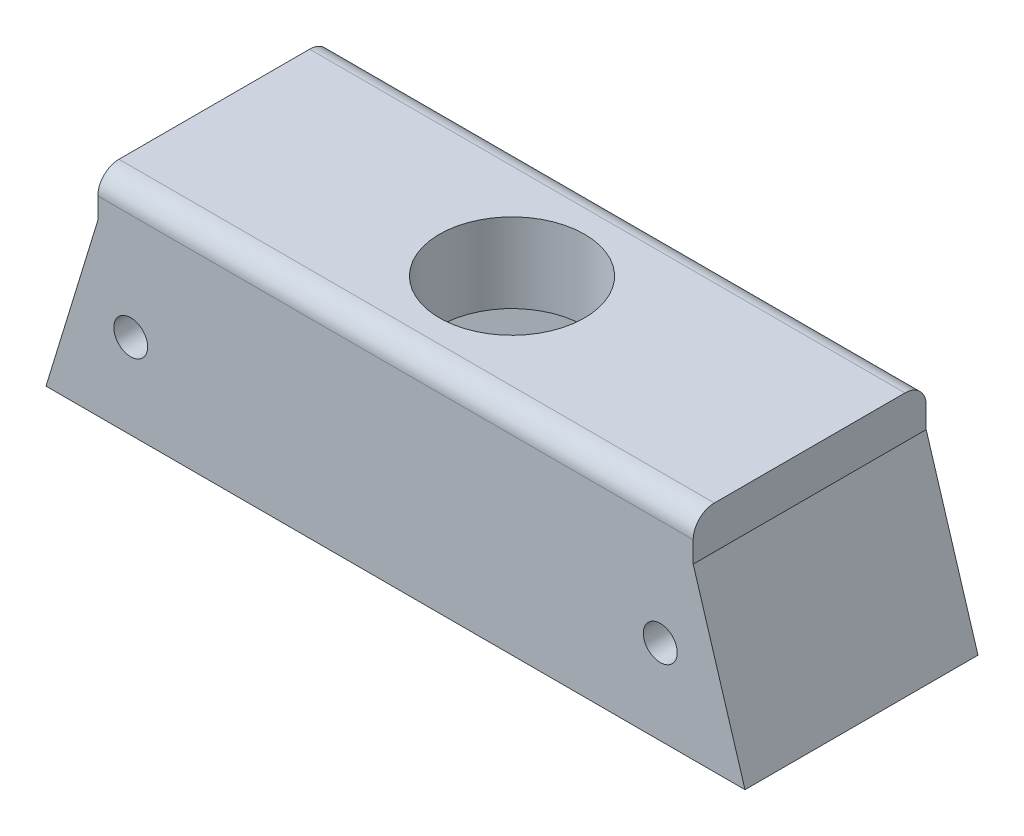
ISO-10303-21;
HEADER;
FILE_DESCRIPTION(('STEP AP214'),'2;1');
FILE_NAME('part.step','',(''),(''),'','','');
FILE_SCHEMA(('AUTOMOTIVE_DESIGN { 1 0 10303 214 1 1 1 1 }'));
ENDSEC;
DATA;
#1=APPLICATION_CONTEXT('core data for automotive mechanical design processes');
#2=APPLICATION_PROTOCOL_DEFINITION('international standard','automotive_design',2000,#1);
#3=PRODUCT_CONTEXT('',#1,'mechanical');
#4=PRODUCT('Part','Part','',(#3));
#5=PRODUCT_RELATED_PRODUCT_CATEGORY('part','',(#4));
#6=PRODUCT_DEFINITION_FORMATION('','',#4);
#7=PRODUCT_DEFINITION_CONTEXT('part definition',#1,'design');
#8=PRODUCT_DEFINITION('design','',#6,#7);
#9=PRODUCT_DEFINITION_SHAPE('','',#8);
#10=(LENGTH_UNIT() NAMED_UNIT(*) SI_UNIT(.MILLI.,.METRE.));
#11=(NAMED_UNIT(*) PLANE_ANGLE_UNIT() SI_UNIT($,.RADIAN.));
#12=(NAMED_UNIT(*) SI_UNIT($,.STERADIAN.) SOLID_ANGLE_UNIT());
#13=UNCERTAINTY_MEASURE_WITH_UNIT(LENGTH_MEASURE(1.E-05),#10,'distance_accuracy_value','');
#14=(GEOMETRIC_REPRESENTATION_CONTEXT(3) GLOBAL_UNCERTAINTY_ASSIGNED_CONTEXT((#13)) GLOBAL_UNIT_ASSIGNED_CONTEXT((#10,
#11,#12)) REPRESENTATION_CONTEXT('',''));
#15=CARTESIAN_POINT('',(0.,0.,0.));
#16=DIRECTION('',(0.,0.,1.));
#17=DIRECTION('',(1.,0.,0.));
#18=AXIS2_PLACEMENT_3D('',#15,#16,#17);
#19=CARTESIAN_POINT('',(0.,4.75,0.));
#20=DIRECTION('',(0.,-1.,0.));
#21=DIRECTION('',(1.,0.,0.));
#22=AXIS2_PLACEMENT_3D('',#19,#20,#21);
#23=PLANE('',#22);
#24=DIRECTION('',(-1.,0.,0.));
#25=VECTOR('',#24,1.);
#26=CARTESIAN_POINT('',(-11.,4.75,4.));
#27=LINE('',#26,#25);
#28=CARTESIAN_POINT('',(11.,4.75000000000001,4.));
#29=VERTEX_POINT('',#28);
#30=CARTESIAN_POINT('',(5.49173793336482,4.75000000000001,4.));
#31=VERTEX_POINT('',#30);
#32=EDGE_CURVE('E363',#29,#31,#27,.T.);
#33=ORIENTED_EDGE('',*,*,#32,.T.);
#34=CARTESIAN_POINT('',(0.,4.75,0.));
#35=DIRECTION('',(0.,-1.,0.));
#36=DIRECTION('',(1.,0.,0.));
#37=AXIS2_PLACEMENT_3D('',#34,#35,#36);
#38=CIRCLE('',#37,6.7940551608563);
#39=CARTESIAN_POINT('',(5.49173793336482,4.75000000000001,-4.));
#40=VERTEX_POINT('',#39);
#41=EDGE_CURVE('E258',#31,#40,#38,.F.);
#42=ORIENTED_EDGE('',*,*,#41,.T.);
#43=DIRECTION('',(1.,0.,0.));
#44=VECTOR('',#43,1.);
#45=CARTESIAN_POINT('',(-11.,4.75,-4.));
#46=LINE('',#45,#44);
#47=CARTESIAN_POINT('',(11.,4.75000000000001,-4.));
#48=VERTEX_POINT('',#47);
#49=EDGE_CURVE('E332',#40,#48,#46,.T.);
#50=ORIENTED_EDGE('',*,*,#49,.T.);
#51=DIRECTION('',(0.,0.,1.));
#52=VECTOR('',#51,1.);
#53=CARTESIAN_POINT('',(11.,4.75000000000001,4.));
#54=LINE('',#53,#52);
#55=EDGE_CURVE('E331',#48,#29,#54,.T.);
#56=ORIENTED_EDGE('',*,*,#55,.T.);
#57=EDGE_LOOP('',(#33,#42,#50,#56));
#58=FACE_BOUND('',#57,.T.);
#59=ADVANCED_FACE('F38',(#58),#23,.T.);
#60=CARTESIAN_POINT('',(0.,8.000012,0.));
#61=DIRECTION('',(0.,-1.,0.));
#62=DIRECTION('',(0.,0.,-1.));
#63=AXIS2_PLACEMENT_3D('',#60,#61,#62);
#64=CYLINDRICAL_SURFACE('',#63,3.425);
#65=CARTESIAN_POINT('',(0.,6.25,0.));
#66=DIRECTION('',(0.,-1.,0.));
#67=DIRECTION('',(0.,0.,-1.));
#68=AXIS2_PLACEMENT_3D('',#65,#66,#67);
#69=CIRCLE('',#68,3.425);
#70=CARTESIAN_POINT('',(0.,6.25,-3.425));
#71=VERTEX_POINT('',#70);
#72=EDGE_CURVE('E253',#71,#71,#69,.T.);
#73=CARTESIAN_POINT('',(0.,10.,0.));
#74=DIRECTION('',(0.,1.,0.));
#75=DIRECTION('',(0.,0.,1.));
#76=AXIS2_PLACEMENT_3D('',#73,#74,#75);
#77=CIRCLE('',#76,3.425);
#78=CARTESIAN_POINT('',(0.,10.,-3.425));
#79=VERTEX_POINT('',#78);
#80=EDGE_CURVE('E474',#79,#79,#77,.T.);
#81=CARTESIAN_POINT('',(0.,6.25,-3.425));
#82=CARTESIAN_POINT('',(0.,6.2890625,-3.425));
#83=CARTESIAN_POINT('',(0.,6.328125,-3.425));
#84=CARTESIAN_POINT('',(0.,6.40625,-3.425));
#85=CARTESIAN_POINT('',(0.,6.4453125,-3.425));
#86=CARTESIAN_POINT('',(0.,6.5234375,-3.425));
#87=CARTESIAN_POINT('',(0.,6.5625,-3.425));
#88=CARTESIAN_POINT('',(0.,6.640625,-3.425));
#89=CARTESIAN_POINT('',(0.,6.6796875,-3.425));
#90=CARTESIAN_POINT('',(0.,6.7578125,-3.425));
#91=CARTESIAN_POINT('',(0.,6.796875,-3.425));
#92=CARTESIAN_POINT('',(0.,6.875,-3.425));
#93=CARTESIAN_POINT('',(0.,6.9140625,-3.425));
#94=CARTESIAN_POINT('',(0.,6.9921875,-3.425));
#95=CARTESIAN_POINT('',(0.,7.03125,-3.425));
#96=CARTESIAN_POINT('',(0.,7.109375,-3.425));
#97=CARTESIAN_POINT('',(0.,7.1484375,-3.425));
#98=CARTESIAN_POINT('',(0.,7.2265625,-3.425));
#99=CARTESIAN_POINT('',(0.,7.265625,-3.425));
#100=CARTESIAN_POINT('',(0.,7.34375,-3.425));
#101=CARTESIAN_POINT('',(0.,7.3828125,-3.425));
#102=CARTESIAN_POINT('',(0.,7.4609375,-3.425));
#103=CARTESIAN_POINT('',(0.,7.5,-3.425));
#104=CARTESIAN_POINT('',(0.,7.578125,-3.425));
#105=CARTESIAN_POINT('',(0.,7.6171875,-3.425));
#106=CARTESIAN_POINT('',(0.,7.6953125,-3.425));
#107=CARTESIAN_POINT('',(0.,7.734375,-3.425));
#108=CARTESIAN_POINT('',(0.,7.8125,-3.425));
#109=CARTESIAN_POINT('',(0.,7.8515625,-3.425));
#110=CARTESIAN_POINT('',(0.,7.9296875,-3.425));
#111=CARTESIAN_POINT('',(0.,7.96875,-3.425));
#112=CARTESIAN_POINT('',(0.,8.046875,-3.425));
#113=CARTESIAN_POINT('',(0.,8.0859375,-3.425));
#114=CARTESIAN_POINT('',(0.,8.1640625,-3.425));
#115=CARTESIAN_POINT('',(0.,8.203125,-3.425));
#116=CARTESIAN_POINT('',(0.,8.28125,-3.425));
#117=CARTESIAN_POINT('',(0.,8.3203125,-3.425));
#118=CARTESIAN_POINT('',(0.,8.3984375,-3.425));
#119=CARTESIAN_POINT('',(0.,8.4375,-3.425));
#120=CARTESIAN_POINT('',(0.,8.515625,-3.425));
#121=CARTESIAN_POINT('',(0.,8.5546875,-3.425));
#122=CARTESIAN_POINT('',(0.,8.6328125,-3.425));
#123=CARTESIAN_POINT('',(0.,8.671875,-3.425));
#124=CARTESIAN_POINT('',(0.,8.75,-3.425));
#125=CARTESIAN_POINT('',(0.,8.7890625,-3.425));
#126=CARTESIAN_POINT('',(0.,8.8671875,-3.425));
#127=CARTESIAN_POINT('',(0.,8.90625,-3.425));
#128=CARTESIAN_POINT('',(0.,8.984375,-3.425));
#129=CARTESIAN_POINT('',(0.,9.0234375,-3.425));
#130=CARTESIAN_POINT('',(0.,9.1015625,-3.425));
#131=CARTESIAN_POINT('',(0.,9.140625,-3.425));
#132=CARTESIAN_POINT('',(0.,9.21875,-3.425));
#133=CARTESIAN_POINT('',(0.,9.2578125,-3.425));
#134=CARTESIAN_POINT('',(0.,9.3359375,-3.425));
#135=CARTESIAN_POINT('',(0.,9.375,-3.425));
#136=CARTESIAN_POINT('',(0.,9.453125,-3.425));
#137=CARTESIAN_POINT('',(0.,9.4921875,-3.425));
#138=CARTESIAN_POINT('',(0.,9.5703125,-3.425));
#139=CARTESIAN_POINT('',(0.,9.609375,-3.425));
#140=CARTESIAN_POINT('',(0.,9.6875,-3.425));
#141=CARTESIAN_POINT('',(0.,9.7265625,-3.425));
#142=CARTESIAN_POINT('',(0.,9.8046875,-3.425));
#143=CARTESIAN_POINT('',(0.,9.84375,-3.425));
#144=CARTESIAN_POINT('',(0.,9.921875,-3.425));
#145=CARTESIAN_POINT('',(0.,9.9609375,-3.425));
#146=CARTESIAN_POINT('',(0.,10.,-3.425));
#147=B_SPLINE_CURVE_WITH_KNOTS('',3,(#81,#82,#83,#84,#85,#86,#87,#88,#89,#90,#91,#92,#93,#94,
#95,#96,#97,#98,#99,#100,#101,#102,#103,#104,#105,#106,#107,#108,#109,#110,#111,#112,#113,#114,
#115,#116,#117,#118,#119,#120,#121,#122,#123,#124,#125,#126,#127,#128,#129,#130,#131,#132,#133,
#134,#135,#136,#137,#138,#139,#140,#141,#142,#143,#144,#145,#146),.UNSPECIFIED.,.F.,.F.,(4,2,2,
2,2,2,2,2,2,2,2,2,2,2,2,2,2,2,2,2,2,2,2,2,2,2,2,2,2,2,2,2,4),(0.,0.1171875,0.234375,0.3515625,
0.46875,0.585937500000001,0.703125000000001,0.820312500000001,0.9375,1.0546875,1.171875,
1.2890625,1.40625,1.5234375,1.640625,1.7578125,1.875,1.9921875,2.109375,2.2265625,2.34375,
2.4609375,2.578125,2.6953125,2.8125,2.9296875,3.046875,3.1640625,3.28125,3.3984375,3.515625,
3.6328125,3.75),.UNSPECIFIED.);
#148=EDGE_CURVE('BSEAM297',#71,#79,#147,.T.);
#149=ORIENTED_EDGE('',*,*,#72,.T.);
#150=ORIENTED_EDGE('',*,*,#80,.T.);
#151=ORIENTED_EDGE('',*,*,#148,.T.);
#152=ORIENTED_EDGE('',*,*,#148,.F.);
#153=EDGE_LOOP('',(#149,#151,#150,#152));
#154=FACE_BOUND('',#153,.T.);
#155=ADVANCED_FACE('F297',(#154),#64,.F.);
#156=CARTESIAN_POINT('',(14.2356732963533,2.50000000000001,-35.6039864469807));
#157=DIRECTION('',(0.,1.,0.));
#158=DIRECTION('',(-1.,0.,0.));
#159=AXIS2_PLACEMENT_3D('',#156,#157,#158);
#160=PLANE('',#159);
#161=DIRECTION('',(-1.,0.,0.));
#162=VECTOR('',#161,1.);
#163=CARTESIAN_POINT('',(14.2356732963533,2.50000000000001,-3.99999999999997));
#164=LINE('',#163,#162);
#165=CARTESIAN_POINT('',(-12.1230183869521,2.5,-3.99999999999997));
#166=VERTEX_POINT('',#165);
#167=CARTESIAN_POINT('',(-14.2356732963533,2.5,-3.99999999999997));
#168=VERTEX_POINT('',#167);
#169=EDGE_CURVE('E392',#166,#168,#164,.T.);
#170=ORIENTED_EDGE('',*,*,#169,.F.);
#171=DIRECTION('',(0.,0.,1.));
#172=VECTOR('',#171,1.);
#173=CARTESIAN_POINT('',(-12.1230183869521,2.5,-35.6039864469807));
#174=LINE('',#173,#172);
#175=CARTESIAN_POINT('',(-12.1230183869521,2.5,4.00000000000003));
#176=VERTEX_POINT('',#175);
#177=EDGE_CURVE('E340',#166,#176,#174,.T.);
#178=ORIENTED_EDGE('',*,*,#177,.T.);
#179=DIRECTION('',(-1.,0.,0.));
#180=VECTOR('',#179,1.);
#181=CARTESIAN_POINT('',(14.2356732963533,2.50000000000001,4.00000000000003));
#182=LINE('',#181,#180);
#183=CARTESIAN_POINT('',(-14.2356732963534,2.5,4.00000000000003));
#184=VERTEX_POINT('',#183);
#185=EDGE_CURVE('E376',#176,#184,#182,.T.);
#186=ORIENTED_EDGE('',*,*,#185,.T.);
#187=DIRECTION('',(0.,0.,1.));
#188=VECTOR('',#187,1.);
#189=CARTESIAN_POINT('',(-14.2356732963534,2.5,-35.6039864469807));
#190=LINE('',#189,#188);
#191=EDGE_CURVE('E389',#168,#184,#190,.T.);
#192=ORIENTED_EDGE('',*,*,#191,.F.);
#193=EDGE_LOOP('',(#170,#178,#186,#192));
#194=FACE_BOUND('',#193,.T.);
#195=ADVANCED_FACE('F304',(#194),#160,.F.);
#196=CARTESIAN_POINT('',(0.,8.,-5.49999999999997));
#197=DIRECTION('',(0.,0.,-1.));
#198=DIRECTION('',(-1.,0.,0.));
#199=AXIS2_PLACEMENT_3D('',#196,#197,#198);
#200=PLANE('',#199);
#201=DIRECTION('',(0.,-1.,0.));
#202=VECTOR('',#201,1.);
#203=CARTESIAN_POINT('',(-14.0541545483307,10.,-5.49999999999997));
#204=LINE('',#203,#202);
#205=CARTESIAN_POINT('',(-14.0541545483307,9.,-5.49999999999997));
#206=VERTEX_POINT('',#205);
#207=CARTESIAN_POINT('',(-14.0541545483307,8.,-5.49999999999997));
#208=VERTEX_POINT('',#207);
#209=EDGE_CURVE('E194',#206,#208,#204,.T.);
#210=ORIENTED_EDGE('',*,*,#209,.F.);
#211=DIRECTION('',(-1.,0.,0.));
#212=VECTOR('',#211,1.);
#213=CARTESIAN_POINT('',(0.,9.,-5.49999999999997));
#214=LINE('',#213,#212);
#215=CARTESIAN_POINT('',(14.0541545483307,9.,-5.49999999999997));
#216=VERTEX_POINT('',#215);
#217=EDGE_CURVE('E246',#206,#216,#214,.F.);
#218=ORIENTED_EDGE('',*,*,#217,.T.);
#219=DIRECTION('',(0.,-1.,0.));
#220=VECTOR('',#219,1.);
#221=CARTESIAN_POINT('',(14.0541545483307,10.,-5.49999999999997));
#222=LINE('',#221,#220);
#223=CARTESIAN_POINT('',(14.0541545483307,8.,-5.49999999999997));
#224=VERTEX_POINT('',#223);
#225=EDGE_CURVE('E467',#216,#224,#222,.T.);
#226=ORIENTED_EDGE('',*,*,#225,.T.);
#227=DIRECTION('',(0.292371704722737,-0.956304755963035,0.));
#228=VECTOR('',#227,1.);
#229=CARTESIAN_POINT('',(16.5,0.,-5.49999999999997));
#230=LINE('',#229,#228);
#231=CARTESIAN_POINT('',(16.5,0.,-5.49999999999997));
#232=VERTEX_POINT('',#231);
#233=EDGE_CURVE('E207',#224,#232,#230,.T.);
#234=ORIENTED_EDGE('',*,*,#233,.T.);
#235=DIRECTION('',(1.,0.,0.));
#236=VECTOR('',#235,1.);
#237=CARTESIAN_POINT('',(0.,0.,-5.49999999999997));
#238=LINE('',#237,#236);
#239=CARTESIAN_POINT('',(-16.5,0.,-5.49999999999997));
#240=VERTEX_POINT('',#239);
#241=EDGE_CURVE('E230',#240,#232,#238,.T.);
#242=ORIENTED_EDGE('',*,*,#241,.F.);
#243=DIRECTION('',(0.292371704722737,0.956304755963035,0.));
#244=VECTOR('',#243,1.);
#245=CARTESIAN_POINT('',(-16.5,0.,-5.49999999999997));
#246=LINE('',#245,#244);
#247=EDGE_CURVE('E198',#240,#208,#246,.T.);
#248=ORIENTED_EDGE('',*,*,#247,.T.);
#249=EDGE_LOOP('',(#210,#218,#226,#234,#242,#248));
#250=FACE_BOUND('',#249,.T.);
#251=CARTESIAN_POINT('',(-12.5,4.,-5.49999999999997));
#252=DIRECTION('',(0.,0.,1.));
#253=DIRECTION('',(1.,0.,0.));
#254=AXIS2_PLACEMENT_3D('',#251,#252,#253);
#255=CIRCLE('',#254,0.800000000000001);
#256=CARTESIAN_POINT('',(-11.7,4.,-5.49999999999997));
#257=VERTEX_POINT('',#256);
#258=EDGE_CURVE('E216',#257,#257,#255,.T.);
#259=ORIENTED_EDGE('',*,*,#258,.T.);
#260=EDGE_LOOP('',(#259));
#261=FACE_BOUND('',#260,.T.);
#262=CARTESIAN_POINT('',(12.5,4.,-5.49999999999997));
#263=DIRECTION('',(0.,0.,1.));
#264=DIRECTION('',(1.,0.,0.));
#265=AXIS2_PLACEMENT_3D('',#262,#263,#264);
#266=CIRCLE('',#265,0.800000000000001);
#267=CARTESIAN_POINT('',(13.3,4.,-5.49999999999997));
#268=VERTEX_POINT('',#267);
#269=EDGE_CURVE('E223',#268,#268,#266,.T.);
#270=ORIENTED_EDGE('',*,*,#269,.T.);
#271=EDGE_LOOP('',(#270));
#272=FACE_BOUND('',#271,.T.);
#273=ADVANCED_FACE('F435',(#250,#261,#272),#200,.T.);
#274=CARTESIAN_POINT('',(0.,8.,5.50000000000003));
#275=DIRECTION('',(0.,0.,-1.));
#276=DIRECTION('',(-1.,0.,0.));
#277=AXIS2_PLACEMENT_3D('',#274,#275,#276);
#278=PLANE('',#277);
#279=CARTESIAN_POINT('',(-12.5,4.,5.50000000000003));
#280=DIRECTION('',(0.,0.,1.));
#281=DIRECTION('',(1.,0.,0.));
#282=AXIS2_PLACEMENT_3D('',#279,#280,#281);
#283=CIRCLE('',#282,0.800000000000001);
#284=CARTESIAN_POINT('',(-11.7,4.,5.50000000000003));
#285=VERTEX_POINT('',#284);
#286=EDGE_CURVE('E220',#285,#285,#283,.T.);
#287=ORIENTED_EDGE('',*,*,#286,.F.);
#288=EDGE_LOOP('',(#287));
#289=FACE_BOUND('',#288,.T.);
#290=CARTESIAN_POINT('',(12.5,4.,5.50000000000003));
#291=DIRECTION('',(0.,0.,1.));
#292=DIRECTION('',(1.,0.,0.));
#293=AXIS2_PLACEMENT_3D('',#290,#291,#292);
#294=CIRCLE('',#293,0.800000000000001);
#295=CARTESIAN_POINT('',(13.3,4.,5.50000000000003));
#296=VERTEX_POINT('',#295);
#297=EDGE_CURVE('E197',#296,#296,#294,.T.);
#298=ORIENTED_EDGE('',*,*,#297,.F.);
#299=EDGE_LOOP('',(#298));
#300=FACE_BOUND('',#299,.T.);
#301=DIRECTION('',(0.,-1.,0.));
#302=VECTOR('',#301,1.);
#303=CARTESIAN_POINT('',(14.0541545483307,10.,5.50000000000003));
#304=LINE('',#303,#302);
#305=CARTESIAN_POINT('',(14.0541545483307,9.,5.50000000000003));
#306=VERTEX_POINT('',#305);
#307=CARTESIAN_POINT('',(14.0541545483307,8.,5.50000000000003));
#308=VERTEX_POINT('',#307);
#309=EDGE_CURVE('E187',#306,#308,#304,.T.);
#310=ORIENTED_EDGE('',*,*,#309,.F.);
#311=DIRECTION('',(1.,0.,0.));
#312=VECTOR('',#311,1.);
#313=CARTESIAN_POINT('',(-14.0541545483307,9.,5.50000000000003));
#314=LINE('',#313,#312);
#315=CARTESIAN_POINT('',(-14.0541545483307,9.,5.50000000000003));
#316=VERTEX_POINT('',#315);
#317=EDGE_CURVE('E183',#306,#316,#314,.F.);
#318=ORIENTED_EDGE('',*,*,#317,.T.);
#319=DIRECTION('',(0.,-1.,0.));
#320=VECTOR('',#319,1.);
#321=CARTESIAN_POINT('',(-14.0541545483307,10.,5.50000000000003));
#322=LINE('',#321,#320);
#323=CARTESIAN_POINT('',(-14.0541545483307,8.,5.50000000000003));
#324=VERTEX_POINT('',#323);
#325=EDGE_CURVE('E174',#316,#324,#322,.T.);
#326=ORIENTED_EDGE('',*,*,#325,.T.);
#327=DIRECTION('',(0.292371704722737,0.956304755963035,0.));
#328=VECTOR('',#327,1.);
#329=CARTESIAN_POINT('',(-16.5,0.,5.50000000000003));
#330=LINE('',#329,#328);
#331=CARTESIAN_POINT('',(-16.5,0.,5.50000000000003));
#332=VERTEX_POINT('',#331);
#333=EDGE_CURVE('E180',#332,#324,#330,.T.);
#334=ORIENTED_EDGE('',*,*,#333,.F.);
#335=DIRECTION('',(1.,0.,0.));
#336=VECTOR('',#335,1.);
#337=CARTESIAN_POINT('',(0.,0.,5.50000000000003));
#338=LINE('',#337,#336);
#339=CARTESIAN_POINT('',(16.5,0.,5.50000000000003));
#340=VERTEX_POINT('',#339);
#341=EDGE_CURVE('E234',#332,#340,#338,.T.);
#342=ORIENTED_EDGE('',*,*,#341,.T.);
#343=DIRECTION('',(0.292371704722737,-0.956304755963035,0.));
#344=VECTOR('',#343,1.);
#345=CARTESIAN_POINT('',(16.5,0.,5.50000000000003));
#346=LINE('',#345,#344);
#347=EDGE_CURVE('E213',#308,#340,#346,.T.);
#348=ORIENTED_EDGE('',*,*,#347,.F.);
#349=EDGE_LOOP('',(#310,#318,#326,#334,#342,#348));
#350=FACE_BOUND('',#349,.T.);
#351=ADVANCED_FACE('F177',(#289,#300,#350),#278,.F.);
#352=CARTESIAN_POINT('',(0.,0.,0.));
#353=DIRECTION('',(0.,1.,0.));
#354=DIRECTION('',(0.,0.,1.));
#355=AXIS2_PLACEMENT_3D('',#352,#353,#354);
#356=PLANE('',#355);
#357=DIRECTION('',(1.,0.,0.));
#358=VECTOR('',#357,1.);
#359=CARTESIAN_POINT('',(-15.,0.,4.00000000000003));
#360=LINE('',#359,#358);
#361=CARTESIAN_POINT('',(-15.,0.,4.00000000000003));
#362=VERTEX_POINT('',#361);
#363=CARTESIAN_POINT('',(15.,0.,4.00000000000003));
#364=VERTEX_POINT('',#363);
#365=EDGE_CURVE('E380',#362,#364,#360,.T.);
#366=ORIENTED_EDGE('',*,*,#365,.T.);
#367=DIRECTION('',(0.,0.,1.));
#368=VECTOR('',#367,1.);
#369=CARTESIAN_POINT('',(15.,0.,-35.6039864469807));
#370=LINE('',#369,#368);
#371=CARTESIAN_POINT('',(15.,0.,-3.99999999999997));
#372=VERTEX_POINT('',#371);
#373=EDGE_CURVE('E386',#372,#364,#370,.T.);
#374=ORIENTED_EDGE('',*,*,#373,.F.);
#375=DIRECTION('',(1.,0.,0.));
#376=VECTOR('',#375,1.);
#377=CARTESIAN_POINT('',(-15.,0.,-3.99999999999997));
#378=LINE('',#377,#376);
#379=CARTESIAN_POINT('',(-15.,0.,-3.99999999999997));
#380=VERTEX_POINT('',#379);
#381=EDGE_CURVE('E375',#380,#372,#378,.T.);
#382=ORIENTED_EDGE('',*,*,#381,.F.);
#383=DIRECTION('',(0.,0.,1.));
#384=VECTOR('',#383,1.);
#385=CARTESIAN_POINT('',(-15.,0.,-35.6039864469807));
#386=LINE('',#385,#384);
#387=EDGE_CURVE('E214',#380,#362,#386,.T.);
#388=ORIENTED_EDGE('',*,*,#387,.T.);
#389=EDGE_LOOP('',(#366,#374,#382,#388));
#390=FACE_BOUND('',#389,.T.);
#391=DIRECTION('',(0.,0.,1.));
#392=VECTOR('',#391,1.);
#393=CARTESIAN_POINT('',(16.5,0.,0.));
#394=LINE('',#393,#392);
#395=EDGE_CURVE('E219',#232,#340,#394,.T.);
#396=ORIENTED_EDGE('',*,*,#395,.T.);
#397=ORIENTED_EDGE('',*,*,#341,.F.);
#398=DIRECTION('',(0.,0.,1.));
#399=VECTOR('',#398,1.);
#400=CARTESIAN_POINT('',(-16.5,0.,0.));
#401=LINE('',#400,#399);
#402=EDGE_CURVE('E202',#240,#332,#401,.T.);
#403=ORIENTED_EDGE('',*,*,#402,.F.);
#404=ORIENTED_EDGE('',*,*,#241,.T.);
#405=EDGE_LOOP('',(#396,#397,#403,#404));
#406=FACE_BOUND('',#405,.T.);
#407=ADVANCED_FACE('F404',(#390,#406),#356,.F.);
#408=CARTESIAN_POINT('',(12.5,4.,-5.49999999999997));
#409=DIRECTION('',(0.,0.,1.));
#410=DIRECTION('',(1.,0.,0.));
#411=AXIS2_PLACEMENT_3D('',#408,#409,#410);
#412=CYLINDRICAL_SURFACE('',#411,0.800000000000001);
#413=ORIENTED_EDGE('',*,*,#269,.F.);
#414=EDGE_LOOP('',(#413));
#415=FACE_BOUND('',#414,.T.);
#416=ORIENTED_EDGE('',*,*,#297,.T.);
#417=EDGE_LOOP('',(#416));
#418=FACE_BOUND('',#417,.T.);
#419=ADVANCED_FACE('F484',(#415,#418),#412,.F.);
#420=CARTESIAN_POINT('',(-12.5,4.,-5.49999999999997));
#421=DIRECTION('',(0.,0.,1.));
#422=DIRECTION('',(1.,0.,0.));
#423=AXIS2_PLACEMENT_3D('',#420,#421,#422);
#424=CYLINDRICAL_SURFACE('',#423,0.800000000000001);
#425=ORIENTED_EDGE('',*,*,#258,.F.);
#426=EDGE_LOOP('',(#425));
#427=FACE_BOUND('',#426,.T.);
#428=ORIENTED_EDGE('',*,*,#286,.T.);
#429=EDGE_LOOP('',(#428));
#430=FACE_BOUND('',#429,.T.);
#431=ADVANCED_FACE('F488',(#427,#430),#424,.F.);
#432=CARTESIAN_POINT('',(16.5,0.,-5.49999999999997));
#433=DIRECTION('',(-0.956304755963036,-0.292371704722737,0.));
#434=DIRECTION('',(0.292371704722737,-0.956304755963035,0.));
#435=AXIS2_PLACEMENT_3D('',#432,#433,#434);
#436=PLANE('',#435);
#437=ORIENTED_EDGE('',*,*,#347,.T.);
#438=ORIENTED_EDGE('',*,*,#395,.F.);
#439=ORIENTED_EDGE('',*,*,#233,.F.);
#440=DIRECTION('',(0.,0.,1.));
#441=VECTOR('',#440,1.);
#442=CARTESIAN_POINT('',(14.0541545483307,8.,-5.49999999999997));
#443=LINE('',#442,#441);
#444=EDGE_CURVE('E203',#224,#308,#443,.T.);
#445=ORIENTED_EDGE('',*,*,#444,.T.);
#446=EDGE_LOOP('',(#437,#438,#439,#445));
#447=FACE_BOUND('',#446,.T.);
#448=ADVANCED_FACE('F481',(#447),#436,.F.);
#449=CARTESIAN_POINT('',(-16.5,0.,-5.49999999999997));
#450=DIRECTION('',(0.956304755963036,-0.292371704722737,0.));
#451=DIRECTION('',(0.292371704722737,0.956304755963035,0.));
#452=AXIS2_PLACEMENT_3D('',#449,#450,#451);
#453=PLANE('',#452);
#454=ORIENTED_EDGE('',*,*,#333,.T.);
#455=DIRECTION('',(0.,0.,1.));
#456=VECTOR('',#455,1.);
#457=CARTESIAN_POINT('',(-14.0541545483307,8.,-5.49999999999997));
#458=LINE('',#457,#456);
#459=EDGE_CURVE('E190',#208,#324,#458,.T.);
#460=ORIENTED_EDGE('',*,*,#459,.F.);
#461=ORIENTED_EDGE('',*,*,#247,.F.);
#462=ORIENTED_EDGE('',*,*,#402,.T.);
#463=EDGE_LOOP('',(#454,#460,#461,#462));
#464=FACE_BOUND('',#463,.T.);
#465=ADVANCED_FACE('F200',(#464),#453,.F.);
#466=CARTESIAN_POINT('',(0.,8.,-3.99999999999997));
#467=DIRECTION('',(0.,0.,-1.));
#468=DIRECTION('',(-1.,0.,0.));
#469=AXIS2_PLACEMENT_3D('',#466,#467,#468);
#470=PLANE('',#469);
#471=DIRECTION('',(-0.292371704722741,-0.956304755963034,0.));
#472=VECTOR('',#471,1.);
#473=CARTESIAN_POINT('',(-14.2356732963534,2.5,-3.99999999999997));
#474=LINE('',#473,#472);
#475=EDGE_CURVE('E387',#168,#380,#474,.T.);
#476=ORIENTED_EDGE('',*,*,#475,.T.);
#477=ORIENTED_EDGE('',*,*,#381,.T.);
#478=DIRECTION('',(-0.292371704722741,0.956304755963034,0.));
#479=VECTOR('',#478,1.);
#480=CARTESIAN_POINT('',(15.,0.,-3.99999999999997));
#481=LINE('',#480,#479);
#482=CARTESIAN_POINT('',(14.2356732963533,2.50000000000001,-3.99999999999997));
#483=VERTEX_POINT('',#482);
#484=EDGE_CURVE('E393',#372,#483,#481,.T.);
#485=ORIENTED_EDGE('',*,*,#484,.T.);
#486=CARTESIAN_POINT('',(12.1230183869521,2.50000000000001,-3.99999999999997));
#487=VERTEX_POINT('',#486);
#488=EDGE_CURVE('E390',#483,#487,#164,.T.);
#489=ORIENTED_EDGE('',*,*,#488,.T.);
#490=DIRECTION('',(0.913545457642601,-0.4067366430758,0.));
#491=VECTOR('',#490,1.);
#492=CARTESIAN_POINT('',(-0.038080398667202,7.91447002422853,-3.99999999999997));
#493=LINE('',#492,#491);
#494=CARTESIAN_POINT('',(11.,3.00000000000001,-4.));
#495=VERTEX_POINT('',#494);
#496=EDGE_CURVE('E12',#487,#495,#493,.F.);
#497=ORIENTED_EDGE('',*,*,#496,.T.);
#498=DIRECTION('',(0.,-1.,0.));
#499=VECTOR('',#498,1.);
#500=CARTESIAN_POINT('',(11.,4.75000000000001,-4.));
#501=LINE('',#500,#499);
#502=EDGE_CURVE('E359',#48,#495,#501,.T.);
#503=ORIENTED_EDGE('',*,*,#502,.F.);
#504=ORIENTED_EDGE('',*,*,#49,.F.);
#505=CARTESIAN_POINT('',(5.49173793336482,4.75000000000001,-4.));
#506=CARTESIAN_POINT('',(5.30180253697663,4.81832271761989,-3.99999999999998));
#507=CARTESIAN_POINT('',(5.11148564925842,4.88561547407367,-3.99999999999997));
#508=CARTESIAN_POINT('',(4.72986349839123,5.01747681774198,-3.99999999999997));
#509=CARTESIAN_POINT('',(4.53855801903354,5.08204477804791,-3.99999999999997));
#510=CARTESIAN_POINT('',(4.1533569848423,5.20823970410501,-3.99999999999997));
#511=CARTESIAN_POINT('',(3.95945280341858,5.26984048936965,-3.99999999999997));
#512=CARTESIAN_POINT('',(3.57028872459284,5.38859617198388,-3.99999999999997));
#513=CARTESIAN_POINT('',(3.37502888996255,5.44575127370909,-3.99999999999997));
#514=CARTESIAN_POINT('',(2.98779292700917,5.55302030017303,-3.99999999999997));
#515=CARTESIAN_POINT('',(2.79585582484937,5.60327393559486,-3.99999999999997));
#516=CARTESIAN_POINT('',(2.41028872556468,5.6969066831806,-3.99999999999997));
#517=CARTESIAN_POINT('',(2.21665869650028,5.74028566534773,-3.99999999999997));
#518=CARTESIAN_POINT('',(1.82823607861232,5.81830527250147,-3.99999999999997));
#519=CARTESIAN_POINT('',(1.63344886890414,5.85297226173704,-3.99999999999997));
#520=CARTESIAN_POINT('',(1.24231126006218,5.91187674214033,-3.99999999999997));
#521=CARTESIAN_POINT('',(1.04596116373091,5.93611620580114,-3.99999999999997));
#522=CARTESIAN_POINT('',(0.644190951878841,5.97324961853229,-3.99999999999997));
#523=CARTESIAN_POINT('',(0.438723692882341,5.98564798615069,-3.99999999999997));
#524=CARTESIAN_POINT('',(0.0274231072090857,5.99629758661805,-3.99999999999997));
#525=CARTESIAN_POINT('',(-0.178410200931649,5.99454951650607,-3.99999999999997));
#526=CARTESIAN_POINT('',(-0.589714648344365,5.97705691910515,-3.99999999999997));
#527=CARTESIAN_POINT('',(-0.795185044480002,5.96129540095603,-3.99999999999997));
#528=CARTESIAN_POINT('',(-1.20474764324985,5.91707856827729,-3.99999999999997));
#529=CARTESIAN_POINT('',(-1.40883966026507,5.88862157740164,-3.99999999999997));
#530=CARTESIAN_POINT('',(-1.81562785066426,5.82092805574934,-3.99999999999997));
#531=CARTESIAN_POINT('',(-2.01832023749794,5.78166922563993,-3.99999999999997));
#532=CARTESIAN_POINT('',(-2.42180732913194,5.69449377396151,-3.99999999999997));
#533=CARTESIAN_POINT('',(-2.62260201786017,5.64657707913589,-3.99999999999997));
#534=CARTESIAN_POINT('',(-3.02245632133868,5.54393708773506,-3.99999999999997));
#535=CARTESIAN_POINT('',(-3.22151567066015,5.48921276878933,-3.99999999999997));
#536=CARTESIAN_POINT('',(-3.6180841162743,5.37447662895211,-3.99999999999997));
#537=CARTESIAN_POINT('',(-3.81559327741488,5.31446503053738,-3.99999999999997));
#538=CARTESIAN_POINT('',(-4.13700467080756,5.2131170857279,-3.99999999999997));
#539=CARTESIAN_POINT('',(-4.26129990038753,5.17301637748221,-3.99999999999997));
#540=CARTESIAN_POINT('',(-4.5093784463171,5.09141242649086,-3.99999999999997));
#541=CARTESIAN_POINT('',(-4.63316193422182,5.04990970532075,-3.99999999999997));
#542=CARTESIAN_POINT('',(-4.87959640132751,4.96593504024467,-3.99999999999997));
#543=CARTESIAN_POINT('',(-5.00224978234431,4.92347012665037,-3.99999999999997));
#544=CARTESIAN_POINT('',(-5.24723492376404,4.83748415252285,-3.99999999999997));
#545=CARTESIAN_POINT('',(-5.36956655456507,4.79396272248646,-3.99999999999997));
#546=CARTESIAN_POINT('',(-5.49173793336482,4.75000000000001,-3.99999999999997));
#547=B_SPLINE_CURVE_WITH_KNOTS('',3,(#505,#506,#507,#508,#509,#510,#511,#512,#513,#514,#515,
#516,#517,#518,#519,#520,#521,#522,#523,#524,#525,#526,#527,#528,#529,#530,#531,#532,#533,#534,
#535,#536,#537,#538,#539,#540,#541,#542,#543,#544,#545,#546),.UNSPECIFIED.,.F.,.F.,(4,2,2,2,2,2,
2,2,2,2,2,2,2,2,2,2,2,2,2,2,4),(0.,0.605562744448862,1.21126406273992,1.82158406673088,
2.43187599667011,3.02699752299293,3.62213030146942,4.21543979199772,4.80863700142726,
5.42569500859265,6.04272261157184,6.66049936267954,7.27835771092678,7.89750126284456,
8.51665005375422,9.13589194107911,9.75510778454113,10.1469115786074,10.5385711855223,
10.9279557472867,11.3174785112139),.UNSPECIFIED.);
#548=CARTESIAN_POINT('',(-5.49173793336482,4.75,-4.));
#549=VERTEX_POINT('',#548);
#550=EDGE_CURVE('E261',#40,#549,#547,.T.);
#551=ORIENTED_EDGE('',*,*,#550,.T.);
#552=CARTESIAN_POINT('',(-11.,4.75,-4.));
#553=VERTEX_POINT('',#552);
#554=EDGE_CURVE('E325',#553,#549,#46,.T.);
#555=ORIENTED_EDGE('',*,*,#554,.F.);
#556=DIRECTION('',(0.,-1.,0.));
#557=VECTOR('',#556,1.);
#558=CARTESIAN_POINT('',(-11.,4.75,-4.));
#559=LINE('',#558,#557);
#560=CARTESIAN_POINT('',(-11.,3.00000000000001,-4.));
#561=VERTEX_POINT('',#560);
#562=EDGE_CURVE('E368',#553,#561,#559,.T.);
#563=ORIENTED_EDGE('',*,*,#562,.T.);
#564=DIRECTION('',(0.913545457642601,0.406736643075799,0.));
#565=VECTOR('',#564,1.);
#566=CARTESIAN_POINT('',(0.0380803986672085,7.91447002422852,-3.99999999999997));
#567=LINE('',#566,#565);
#568=EDGE_CURVE('E344',#561,#166,#567,.F.);
#569=ORIENTED_EDGE('',*,*,#568,.T.);
#570=ORIENTED_EDGE('',*,*,#169,.T.);
#571=EDGE_LOOP('',(#476,#477,#485,#489,#497,#503,#504,#551,#555,#563,#569,#570));
#572=FACE_BOUND('',#571,.T.);
#573=ADVANCED_FACE('F276',(#572),#470,.F.);
#574=CARTESIAN_POINT('',(0.,0.,4.00000000000003));
#575=DIRECTION('',(0.,0.,1.));
#576=DIRECTION('',(1.,0.,0.));
#577=AXIS2_PLACEMENT_3D('',#574,#575,#576);
#578=PLANE('',#577);
#579=DIRECTION('',(-0.292371704722741,-0.956304755963034,0.));
#580=VECTOR('',#579,1.);
#581=CARTESIAN_POINT('',(-14.2356732963534,2.5,4.00000000000003));
#582=LINE('',#581,#580);
#583=EDGE_CURVE('E366',#184,#362,#582,.T.);
#584=ORIENTED_EDGE('',*,*,#583,.F.);
#585=ORIENTED_EDGE('',*,*,#185,.F.);
#586=DIRECTION('',(-0.913545457642601,-0.406736643075799,0.));
#587=VECTOR('',#586,1.);
#588=CARTESIAN_POINT('',(-2.93449890324236,6.59099244966395,4.00000000000003));
#589=LINE('',#588,#587);
#590=CARTESIAN_POINT('',(-11.,3.00000000000001,4.));
#591=VERTEX_POINT('',#590);
#592=EDGE_CURVE('E348',#176,#591,#589,.F.);
#593=ORIENTED_EDGE('',*,*,#592,.T.);
#594=DIRECTION('',(0.,-1.,0.));
#595=VECTOR('',#594,1.);
#596=CARTESIAN_POINT('',(-11.,4.75,4.));
#597=LINE('',#596,#595);
#598=CARTESIAN_POINT('',(-11.,4.75,4.));
#599=VERTEX_POINT('',#598);
#600=EDGE_CURVE('E364',#599,#591,#597,.T.);
#601=ORIENTED_EDGE('',*,*,#600,.F.);
#602=CARTESIAN_POINT('',(-5.49173793336482,4.75,4.));
#603=VERTEX_POINT('',#602);
#604=EDGE_CURVE('E424',#603,#599,#27,.T.);
#605=ORIENTED_EDGE('',*,*,#604,.F.);
#606=CARTESIAN_POINT('',(-5.49173793336482,4.75,4.));
#607=CARTESIAN_POINT('',(-5.30180253697663,4.81832271761989,4.00000000000002));
#608=CARTESIAN_POINT('',(-5.11148564925842,4.88561547407366,4.00000000000002));
#609=CARTESIAN_POINT('',(-4.72986349839122,5.01747681774196,4.00000000000003));
#610=CARTESIAN_POINT('',(-4.53855801903354,5.0820447780479,4.00000000000003));
#611=CARTESIAN_POINT('',(-4.15335698484229,5.20823970410499,4.00000000000003));
#612=CARTESIAN_POINT('',(-3.95945280341857,5.26984048936964,4.00000000000003));
#613=CARTESIAN_POINT('',(-3.57028872459283,5.38859617198387,4.00000000000003));
#614=CARTESIAN_POINT('',(-3.37502888996254,5.44575127370908,4.00000000000003));
#615=CARTESIAN_POINT('',(-2.98779292700916,5.55302030017301,4.00000000000003));
#616=CARTESIAN_POINT('',(-2.79585582484936,5.60327393559484,4.00000000000003));
#617=CARTESIAN_POINT('',(-2.41028872556466,5.69690668318058,4.00000000000003));
#618=CARTESIAN_POINT('',(-2.21665869650027,5.74028566534771,4.00000000000003));
#619=CARTESIAN_POINT('',(-1.82823607861231,5.81830527250146,4.00000000000003));
#620=CARTESIAN_POINT('',(-1.63344886890412,5.85297226173702,4.00000000000003));
#621=CARTESIAN_POINT('',(-1.24231126006216,5.91187674214031,4.00000000000003));
#622=CARTESIAN_POINT('',(-1.04596116373089,5.93611620580112,4.00000000000003));
#623=CARTESIAN_POINT('',(-0.644190951878818,5.97324961853227,4.00000000000003));
#624=CARTESIAN_POINT('',(-0.438723692882318,5.98564798615067,4.00000000000003));
#625=CARTESIAN_POINT('',(-0.0274231072090619,5.99629758661802,4.00000000000003));
#626=CARTESIAN_POINT('',(0.178410200931673,5.99454951650605,4.00000000000003));
#627=CARTESIAN_POINT('',(0.589714648344391,5.97705691910512,4.00000000000003));
#628=CARTESIAN_POINT('',(0.795185044480028,5.961295400956,4.00000000000003));
#629=CARTESIAN_POINT('',(1.20474764324988,5.91707856827726,4.00000000000003));
#630=CARTESIAN_POINT('',(1.40883966026509,5.88862157740162,4.00000000000003));
#631=CARTESIAN_POINT('',(1.81562785066429,5.82092805574931,4.00000000000003));
#632=CARTESIAN_POINT('',(2.01832023749796,5.7816692256399,4.00000000000003));
#633=CARTESIAN_POINT('',(2.42180732913196,5.69449377396149,4.00000000000003));
#634=CARTESIAN_POINT('',(2.6226020178602,5.64657707913586,4.00000000000003));
#635=CARTESIAN_POINT('',(3.02245632133871,5.54393708773504,4.00000000000003));
#636=CARTESIAN_POINT('',(3.22151567066018,5.4892127687893,4.00000000000003));
#637=CARTESIAN_POINT('',(3.61808411627433,5.37447662895209,4.00000000000003));
#638=CARTESIAN_POINT('',(3.81559327741491,5.31446503053735,4.00000000000003));
#639=CARTESIAN_POINT('',(4.13700467080759,5.21311708572787,4.00000000000003));
#640=CARTESIAN_POINT('',(4.26129990038756,5.17301637748218,4.00000000000003));
#641=CARTESIAN_POINT('',(4.50937844631712,5.09141242649083,4.00000000000003));
#642=CARTESIAN_POINT('',(4.63316193422183,5.04990970532073,4.00000000000003));
#643=CARTESIAN_POINT('',(4.87959640132752,4.96593504024465,4.00000000000003));
#644=CARTESIAN_POINT('',(5.00224978234432,4.92347012665035,4.00000000000003));
#645=CARTESIAN_POINT('',(5.24723492376404,4.83748415252284,4.00000000000003));
#646=CARTESIAN_POINT('',(5.36956655456507,4.79396272248645,4.00000000000003));
#647=CARTESIAN_POINT('',(5.49173793336482,4.75,4.00000000000003));
#648=B_SPLINE_CURVE_WITH_KNOTS('',3,(#606,#607,#608,#609,#610,#611,#612,#613,#614,#615,#616,
#617,#618,#619,#620,#621,#622,#623,#624,#625,#626,#627,#628,#629,#630,#631,#632,#633,#634,#635,
#636,#637,#638,#639,#640,#641,#642,#643,#644,#645,#646,#647),.UNSPECIFIED.,.F.,.F.,(4,2,2,2,2,2,
2,2,2,2,2,2,2,2,2,2,2,2,2,2,4),(0.,0.605562744448862,1.21126406273992,1.82158406673088,
2.43187599667011,3.02699752299293,3.62213030146943,4.21543979199773,4.80863700142727,
5.42569500859267,6.04272261157185,6.66049936267956,7.27835771092679,7.89750126284457,
8.51665005375424,9.13589194107913,9.75510778454115,10.1469115786075,10.5385711855223,
10.9279557472866,11.3174785112139),.UNSPECIFIED.);
#649=EDGE_CURVE('E269',#603,#31,#648,.T.);
#650=ORIENTED_EDGE('',*,*,#649,.T.);
#651=ORIENTED_EDGE('',*,*,#32,.F.);
#652=DIRECTION('',(0.,-1.,0.));
#653=VECTOR('',#652,1.);
#654=CARTESIAN_POINT('',(11.,4.75000000000001,4.));
#655=LINE('',#654,#653);
#656=CARTESIAN_POINT('',(11.,3.00000000000001,4.));
#657=VERTEX_POINT('',#656);
#658=EDGE_CURVE('E356',#29,#657,#655,.T.);
#659=ORIENTED_EDGE('',*,*,#658,.T.);
#660=DIRECTION('',(-0.913545457642601,0.4067366430758,0.));
#661=VECTOR('',#660,1.);
#662=CARTESIAN_POINT('',(2.93449890324238,6.59099244966396,4.00000000000003));
#663=LINE('',#662,#661);
#664=CARTESIAN_POINT('',(12.1230183869521,2.50000000000001,4.00000000000003));
#665=VERTEX_POINT('',#664);
#666=EDGE_CURVE('E46',#657,#665,#663,.F.);
#667=ORIENTED_EDGE('',*,*,#666,.T.);
#668=CARTESIAN_POINT('',(14.2356732963533,2.50000000000001,4.00000000000003));
#669=VERTEX_POINT('',#668);
#670=EDGE_CURVE('E373',#669,#665,#182,.T.);
#671=ORIENTED_EDGE('',*,*,#670,.F.);
#672=DIRECTION('',(-0.292371704722741,0.956304755963034,0.));
#673=VECTOR('',#672,1.);
#674=CARTESIAN_POINT('',(15.,0.,4.00000000000003));
#675=LINE('',#674,#673);
#676=EDGE_CURVE('E377',#364,#669,#675,.T.);
#677=ORIENTED_EDGE('',*,*,#676,.F.);
#678=ORIENTED_EDGE('',*,*,#365,.F.);
#679=EDGE_LOOP('',(#584,#585,#593,#601,#605,#650,#651,#659,#667,#671,#677,#678));
#680=FACE_BOUND('',#679,.T.);
#681=ADVANCED_FACE('F362',(#680),#578,.F.);
#682=CARTESIAN_POINT('',(15.,0.,-35.6039864469807));
#683=DIRECTION('',(0.956304755963034,0.292371704722741,0.));
#684=DIRECTION('',(-0.292371704722741,0.956304755963034,0.));
#685=AXIS2_PLACEMENT_3D('',#682,#683,#684);
#686=PLANE('',#685);
#687=ORIENTED_EDGE('',*,*,#373,.T.);
#688=ORIENTED_EDGE('',*,*,#676,.T.);
#689=DIRECTION('',(0.,0.,1.));
#690=VECTOR('',#689,1.);
#691=CARTESIAN_POINT('',(14.2356732963533,2.50000000000001,-35.6039864469807));
#692=LINE('',#691,#690);
#693=EDGE_CURVE('E396',#483,#669,#692,.T.);
#694=ORIENTED_EDGE('',*,*,#693,.F.);
#695=ORIENTED_EDGE('',*,*,#484,.F.);
#696=EDGE_LOOP('',(#687,#688,#694,#695));
#697=FACE_BOUND('',#696,.T.);
#698=ADVANCED_FACE('F416',(#697),#686,.F.);
#699=ORIENTED_EDGE('',*,*,#670,.T.);
#700=DIRECTION('',(0.,0.,-1.));
#701=VECTOR('',#700,1.);
#702=CARTESIAN_POINT('',(12.1230183869521,2.50000000000001,-35.6039864469807));
#703=LINE('',#702,#701);
#704=EDGE_CURVE('E53',#665,#487,#703,.T.);
#705=ORIENTED_EDGE('',*,*,#704,.T.);
#706=ORIENTED_EDGE('',*,*,#488,.F.);
#707=ORIENTED_EDGE('',*,*,#693,.T.);
#708=EDGE_LOOP('',(#699,#705,#706,#707));
#709=FACE_BOUND('',#708,.T.);
#710=ADVANCED_FACE('F426',(#709),#160,.F.);
#711=CARTESIAN_POINT('',(-14.2356732963534,2.5,-35.6039864469807));
#712=DIRECTION('',(-0.956304755963034,0.29237170472274,0.));
#713=DIRECTION('',(-0.292371704722741,-0.956304755963034,0.));
#714=AXIS2_PLACEMENT_3D('',#711,#712,#713);
#715=PLANE('',#714);
#716=ORIENTED_EDGE('',*,*,#191,.T.);
#717=ORIENTED_EDGE('',*,*,#583,.T.);
#718=ORIENTED_EDGE('',*,*,#387,.F.);
#719=ORIENTED_EDGE('',*,*,#475,.F.);
#720=EDGE_LOOP('',(#716,#717,#718,#719));
#721=FACE_BOUND('',#720,.T.);
#722=ADVANCED_FACE('F410',(#721),#715,.F.);
#723=CARTESIAN_POINT('',(-11.,4.75,4.));
#724=DIRECTION('',(-1.,0.,0.));
#725=DIRECTION('',(0.,0.,1.));
#726=AXIS2_PLACEMENT_3D('',#723,#724,#725);
#727=PLANE('',#726);
#728=ORIENTED_EDGE('',*,*,#600,.T.);
#729=DIRECTION('',(0.,0.,-1.));
#730=VECTOR('',#729,1.);
#731=CARTESIAN_POINT('',(-11.,3.00000000000001,4.));
#732=LINE('',#731,#730);
#733=EDGE_CURVE('E338',#591,#561,#732,.T.);
#734=ORIENTED_EDGE('',*,*,#733,.T.);
#735=ORIENTED_EDGE('',*,*,#562,.F.);
#736=DIRECTION('',(0.,0.,-1.));
#737=VECTOR('',#736,1.);
#738=CARTESIAN_POINT('',(-11.,4.75,4.));
#739=LINE('',#738,#737);
#740=EDGE_CURVE('E186',#599,#553,#739,.T.);
#741=ORIENTED_EDGE('',*,*,#740,.F.);
#742=EDGE_LOOP('',(#728,#734,#735,#741));
#743=FACE_BOUND('',#742,.T.);
#744=ADVANCED_FACE('F320',(#743),#727,.F.);
#745=CARTESIAN_POINT('',(11.,4.75000000000001,4.));
#746=DIRECTION('',(1.,0.,0.));
#747=DIRECTION('',(0.,0.,-1.));
#748=AXIS2_PLACEMENT_3D('',#745,#746,#747);
#749=PLANE('',#748);
#750=ORIENTED_EDGE('',*,*,#502,.T.);
#751=DIRECTION('',(0.,0.,1.));
#752=VECTOR('',#751,1.);
#753=CARTESIAN_POINT('',(11.,3.00000000000001,4.));
#754=LINE('',#753,#752);
#755=EDGE_CURVE('E350',#495,#657,#754,.T.);
#756=ORIENTED_EDGE('',*,*,#755,.T.);
#757=ORIENTED_EDGE('',*,*,#658,.F.);
#758=ORIENTED_EDGE('',*,*,#55,.F.);
#759=EDGE_LOOP('',(#750,#756,#757,#758));
#760=FACE_BOUND('',#759,.T.);
#761=ADVANCED_FACE('F312',(#760),#749,.F.);
#762=ORIENTED_EDGE('',*,*,#554,.T.);
#763=CARTESIAN_POINT('',(0.,4.75,0.));
#764=DIRECTION('',(0.,-1.,0.));
#765=DIRECTION('',(1.,0.,0.));
#766=AXIS2_PLACEMENT_3D('',#763,#764,#765);
#767=CIRCLE('',#766,6.7940551608563);
#768=EDGE_CURVE('E256',#549,#603,#767,.F.);
#769=ORIENTED_EDGE('',*,*,#768,.T.);
#770=ORIENTED_EDGE('',*,*,#604,.T.);
#771=ORIENTED_EDGE('',*,*,#740,.T.);
#772=EDGE_LOOP('',(#762,#769,#770,#771));
#773=FACE_BOUND('',#772,.T.);
#774=ADVANCED_FACE('F300',(#773),#23,.T.);
#775=CARTESIAN_POINT('',(0.,10.,0.));
#776=DIRECTION('',(0.,1.,0.));
#777=DIRECTION('',(0.,0.,1.));
#778=AXIS2_PLACEMENT_3D('',#775,#776,#777);
#779=PLANE('',#778);
#780=DIRECTION('',(0.,0.,-1.));
#781=VECTOR('',#780,1.);
#782=CARTESIAN_POINT('',(14.0541545483307,10.,5.50000000000003));
#783=LINE('',#782,#781);
#784=CARTESIAN_POINT('',(14.0541545483307,10.,4.50000000000003));
#785=VERTEX_POINT('',#784);
#786=CARTESIAN_POINT('',(14.0541545483307,10.,-4.49999999999997));
#787=VERTEX_POINT('',#786);
#788=EDGE_CURVE('E465',#785,#787,#783,.T.);
#789=ORIENTED_EDGE('',*,*,#788,.T.);
#790=DIRECTION('',(-1.,0.,0.));
#791=VECTOR('',#790,1.);
#792=CARTESIAN_POINT('',(0.,10.,-4.49999999999997));
#793=LINE('',#792,#791);
#794=CARTESIAN_POINT('',(-14.0541545483307,10.,-4.49999999999997));
#795=VERTEX_POINT('',#794);
#796=EDGE_CURVE('E239',#787,#795,#793,.T.);
#797=ORIENTED_EDGE('',*,*,#796,.T.);
#798=DIRECTION('',(0.,0.,1.));
#799=VECTOR('',#798,1.);
#800=CARTESIAN_POINT('',(-14.0541545483307,10.,-5.49999999999997));
#801=LINE('',#800,#799);
#802=CARTESIAN_POINT('',(-14.0541545483307,10.,4.50000000000003));
#803=VERTEX_POINT('',#802);
#804=EDGE_CURVE('E471',#795,#803,#801,.T.);
#805=ORIENTED_EDGE('',*,*,#804,.T.);
#806=DIRECTION('',(1.,0.,0.));
#807=VECTOR('',#806,1.);
#808=CARTESIAN_POINT('',(14.0541545483307,10.,4.50000000000003));
#809=LINE('',#808,#807);
#810=EDGE_CURVE('E236',#803,#785,#809,.T.);
#811=ORIENTED_EDGE('',*,*,#810,.T.);
#812=EDGE_LOOP('',(#789,#797,#805,#811));
#813=FACE_BOUND('',#812,.T.);
#814=ORIENTED_EDGE('',*,*,#80,.F.);
#815=EDGE_LOOP('',(#814));
#816=FACE_BOUND('',#815,.T.);
#817=ADVANCED_FACE('F311',(#813,#816),#779,.T.);
#818=CARTESIAN_POINT('',(-14.0541545483307,10.,-5.49999999999997));
#819=DIRECTION('',(1.,0.,0.));
#820=DIRECTION('',(0.,0.,-1.));
#821=AXIS2_PLACEMENT_3D('',#818,#819,#820);
#822=PLANE('',#821);
#823=ORIENTED_EDGE('',*,*,#804,.F.);
#824=CARTESIAN_POINT('',(-14.0541545483307,9.,-4.49999999999997));
#825=DIRECTION('',(1.,0.,0.));
#826=DIRECTION('',(0.,0.,-1.));
#827=AXIS2_PLACEMENT_3D('',#824,#825,#826);
#828=CIRCLE('',#827,1.);
#829=EDGE_CURVE('E244',#795,#206,#828,.F.);
#830=ORIENTED_EDGE('',*,*,#829,.T.);
#831=ORIENTED_EDGE('',*,*,#209,.T.);
#832=ORIENTED_EDGE('',*,*,#459,.T.);
#833=ORIENTED_EDGE('',*,*,#325,.F.);
#834=CARTESIAN_POINT('',(-14.0541545483307,9.,4.50000000000003));
#835=DIRECTION('',(1.,0.,0.));
#836=DIRECTION('',(0.,0.,-1.));
#837=AXIS2_PLACEMENT_3D('',#834,#835,#836);
#838=CIRCLE('',#837,1.);
#839=EDGE_CURVE('E242',#316,#803,#838,.F.);
#840=ORIENTED_EDGE('',*,*,#839,.T.);
#841=EDGE_LOOP('',(#823,#830,#831,#832,#833,#840));
#842=FACE_BOUND('',#841,.T.);
#843=ADVANCED_FACE('F192',(#842),#822,.F.);
#844=CARTESIAN_POINT('',(14.0541545483307,10.,5.50000000000003));
#845=DIRECTION('',(-1.,0.,0.));
#846=DIRECTION('',(0.,0.,1.));
#847=AXIS2_PLACEMENT_3D('',#844,#845,#846);
#848=PLANE('',#847);
#849=ORIENTED_EDGE('',*,*,#225,.F.);
#850=CARTESIAN_POINT('',(14.0541545483307,9.,-4.49999999999997));
#851=DIRECTION('',(-1.,0.,0.));
#852=DIRECTION('',(0.,0.,1.));
#853=AXIS2_PLACEMENT_3D('',#850,#851,#852);
#854=CIRCLE('',#853,1.);
#855=EDGE_CURVE('E250',#216,#787,#854,.F.);
#856=ORIENTED_EDGE('',*,*,#855,.T.);
#857=ORIENTED_EDGE('',*,*,#788,.F.);
#858=CARTESIAN_POINT('',(14.0541545483307,9.,4.50000000000003));
#859=DIRECTION('',(-1.,0.,0.));
#860=DIRECTION('',(0.,0.,1.));
#861=AXIS2_PLACEMENT_3D('',#858,#859,#860);
#862=CIRCLE('',#861,1.);
#863=EDGE_CURVE('E248',#785,#306,#862,.F.);
#864=ORIENTED_EDGE('',*,*,#863,.T.);
#865=ORIENTED_EDGE('',*,*,#309,.T.);
#866=ORIENTED_EDGE('',*,*,#444,.F.);
#867=EDGE_LOOP('',(#849,#856,#857,#864,#865,#866));
#868=FACE_BOUND('',#867,.T.);
#869=ADVANCED_FACE('F450',(#868),#848,.F.);
#870=CARTESIAN_POINT('',(0.,9.,-4.49999999999997));
#871=DIRECTION('',(-1.,0.,0.));
#872=DIRECTION('',(0.,0.,1.));
#873=AXIS2_PLACEMENT_3D('',#870,#871,#872);
#874=CYLINDRICAL_SURFACE('',#873,1.);
#875=ORIENTED_EDGE('',*,*,#855,.F.);
#876=ORIENTED_EDGE('',*,*,#217,.F.);
#877=ORIENTED_EDGE('',*,*,#829,.F.);
#878=ORIENTED_EDGE('',*,*,#796,.F.);
#879=EDGE_LOOP('',(#875,#876,#877,#878));
#880=FACE_BOUND('',#879,.T.);
#881=ADVANCED_FACE('F448',(#880),#874,.T.);
#882=CARTESIAN_POINT('',(0.,9.,4.50000000000003));
#883=DIRECTION('',(-1.,0.,0.));
#884=DIRECTION('',(0.,0.,1.));
#885=AXIS2_PLACEMENT_3D('',#882,#883,#884);
#886=CYLINDRICAL_SURFACE('',#885,1.);
#887=ORIENTED_EDGE('',*,*,#839,.F.);
#888=ORIENTED_EDGE('',*,*,#317,.F.);
#889=ORIENTED_EDGE('',*,*,#863,.F.);
#890=ORIENTED_EDGE('',*,*,#810,.F.);
#891=EDGE_LOOP('',(#887,#888,#889,#890));
#892=FACE_BOUND('',#891,.T.);
#893=ADVANCED_FACE('F285',(#892),#886,.T.);
#894=CARTESIAN_POINT('',(0.,6.25,0.));
#895=DIRECTION('',(0.,-1.,0.));
#896=DIRECTION('',(0.,0.,-1.));
#897=AXIS2_PLACEMENT_3D('',#894,#895,#896);
#898=CONICAL_SURFACE('',#897,3.425,1.15191730631626);
#899=ORIENTED_EDGE('',*,*,#550,.F.);
#900=ORIENTED_EDGE('',*,*,#41,.F.);
#901=ORIENTED_EDGE('',*,*,#649,.F.);
#902=ORIENTED_EDGE('',*,*,#768,.F.);
#903=EDGE_LOOP('',(#899,#900,#901,#902));
#904=FACE_BOUND('',#903,.T.);
#905=ORIENTED_EDGE('',*,*,#72,.F.);
#906=EDGE_LOOP('',(#905));
#907=FACE_BOUND('',#906,.T.);
#908=ADVANCED_FACE('F280',(#904,#907),#898,.F.);
#909=CARTESIAN_POINT('',(-11.,3.00000000000001,4.));
#910=DIRECTION('',(-0.406736643075799,0.913545457642601,0.));
#911=DIRECTION('',(0.,0.,-1.));
#912=AXIS2_PLACEMENT_3D('',#909,#910,#911);
#913=PLANE('',#912);
#914=ORIENTED_EDGE('',*,*,#592,.F.);
#915=ORIENTED_EDGE('',*,*,#177,.F.);
#916=ORIENTED_EDGE('',*,*,#568,.F.);
#917=ORIENTED_EDGE('',*,*,#733,.F.);
#918=EDGE_LOOP('',(#914,#915,#916,#917));
#919=FACE_BOUND('',#918,.T.);
#920=ADVANCED_FACE('F284',(#919),#913,.F.);
#921=CARTESIAN_POINT('',(11.,3.00000000000001,4.));
#922=DIRECTION('',(0.4067366430758,0.913545457642601,0.));
#923=DIRECTION('',(0.,0.,1.));
#924=AXIS2_PLACEMENT_3D('',#921,#922,#923);
#925=PLANE('',#924);
#926=ORIENTED_EDGE('',*,*,#496,.F.);
#927=ORIENTED_EDGE('',*,*,#704,.F.);
#928=ORIENTED_EDGE('',*,*,#666,.F.);
#929=ORIENTED_EDGE('',*,*,#755,.F.);
#930=EDGE_LOOP('',(#926,#927,#928,#929));
#931=FACE_BOUND('',#930,.T.);
#932=ADVANCED_FACE('F40',(#931),#925,.F.);
#933=CLOSED_SHELL('',(#59,#155,#195,#273,#351,#407,#419,#431,#448,#465,#573,#681,#698,#710,#722,
#744,#761,#774,#817,#843,#869,#881,#893,#908,#920,#932));
#934=MANIFOLD_SOLID_BREP('B2',#933);
#935=ADVANCED_BREP_SHAPE_REPRESENTATION('',(#18,#934),#14);
#936=SHAPE_DEFINITION_REPRESENTATION(#9,#935);
ENDSEC;
END-ISO-10303-21;
